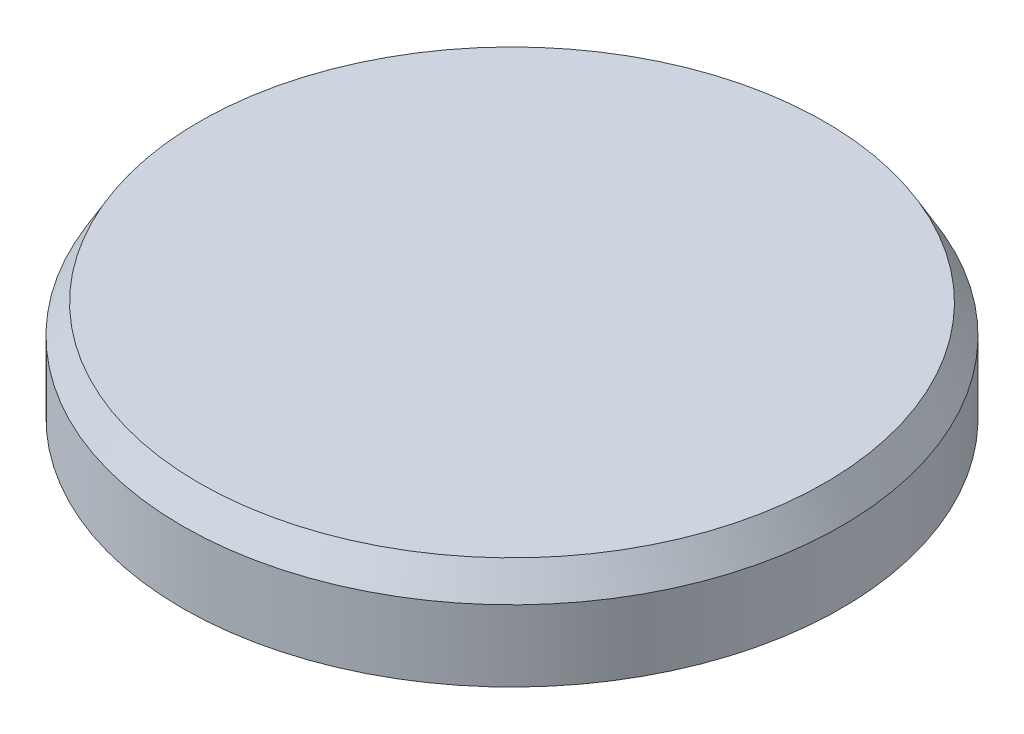
ISO-10303-21;
HEADER;
FILE_DESCRIPTION(('STEP AP214'),'2;1');
FILE_NAME('part.step','',(''),(''),'','','');
FILE_SCHEMA(('AUTOMOTIVE_DESIGN { 1 0 10303 214 1 1 1 1 }'));
ENDSEC;
DATA;
#1=APPLICATION_CONTEXT('core data for automotive mechanical design processes');
#2=APPLICATION_PROTOCOL_DEFINITION('international standard','automotive_design',2000,#1);
#3=PRODUCT_CONTEXT('',#1,'mechanical');
#4=PRODUCT('Part','Part','',(#3));
#5=PRODUCT_RELATED_PRODUCT_CATEGORY('part','',(#4));
#6=PRODUCT_DEFINITION_FORMATION('','',#4);
#7=PRODUCT_DEFINITION_CONTEXT('part definition',#1,'design');
#8=PRODUCT_DEFINITION('design','',#6,#7);
#9=PRODUCT_DEFINITION_SHAPE('','',#8);
#10=(LENGTH_UNIT() NAMED_UNIT(*) SI_UNIT(.MILLI.,.METRE.));
#11=(NAMED_UNIT(*) PLANE_ANGLE_UNIT() SI_UNIT($,.RADIAN.));
#12=(NAMED_UNIT(*) SI_UNIT($,.STERADIAN.) SOLID_ANGLE_UNIT());
#13=UNCERTAINTY_MEASURE_WITH_UNIT(LENGTH_MEASURE(1.E-05),#10,'distance_accuracy_value','');
#14=(GEOMETRIC_REPRESENTATION_CONTEXT(3) GLOBAL_UNCERTAINTY_ASSIGNED_CONTEXT((#13)) GLOBAL_UNIT_ASSIGNED_CONTEXT((#10,
#11,#12)) REPRESENTATION_CONTEXT('',''));
#15=CARTESIAN_POINT('',(0.,0.,0.));
#16=DIRECTION('',(0.,0.,1.));
#17=DIRECTION('',(1.,0.,0.));
#18=AXIS2_PLACEMENT_3D('',#15,#16,#17);
#19=CARTESIAN_POINT('',(0.,-46.6690475583121,0.));
#20=DIRECTION('',(0.,1.,0.));
#21=DIRECTION('',(0.,0.,1.));
#22=AXIS2_PLACEMENT_3D('',#19,#20,#21);
#23=CYLINDRICAL_SURFACE('',#22,16.5);
#24=CARTESIAN_POINT('',(0.,0.,0.));
#25=DIRECTION('',(0.,1.,0.));
#26=DIRECTION('',(0.,0.,1.));
#27=AXIS2_PLACEMENT_3D('',#24,#25,#26);
#28=CIRCLE('',#27,16.5);
#29=CARTESIAN_POINT('',(-12.1854020358643,0.,-11.1250158302968));
#30=VERTEX_POINT('',#29);
#31=CARTESIAN_POINT('',(-12.1854020358645,0.,11.1250158302966));
#32=VERTEX_POINT('',#31);
#33=EDGE_CURVE('E55',#30,#32,#28,.T.);
#34=ORIENTED_EDGE('',*,*,#33,.F.);
#35=DIRECTION('',(0.,1.,0.));
#36=VECTOR('',#35,1.);
#37=CARTESIAN_POINT('',(-12.1854020358644,-10.1044874653482,-11.1250158302967));
#38=LINE('',#37,#36);
#39=CARTESIAN_POINT('',(-12.1854020358643,4.,-11.1250158302968));
#40=VERTEX_POINT('',#39);
#41=EDGE_CURVE('E159',#30,#40,#38,.T.);
#42=ORIENTED_EDGE('',*,*,#41,.T.);
#43=CARTESIAN_POINT('',(0.,4.,0.));
#44=DIRECTION('',(0.,-1.,0.));
#45=DIRECTION('',(0.,0.,-1.));
#46=AXIS2_PLACEMENT_3D('',#43,#44,#45);
#47=CIRCLE('',#46,16.5);
#48=CARTESIAN_POINT('',(-12.1854020358645,4.,11.1250158302966));
#49=VERTEX_POINT('',#48);
#50=EDGE_CURVE('E226',#49,#40,#47,.T.);
#51=ORIENTED_EDGE('',*,*,#50,.F.);
#52=DIRECTION('',(0.,1.,0.));
#53=VECTOR('',#52,1.);
#54=CARTESIAN_POINT('',(-12.1854020358645,-10.1044874653482,11.1250158302966));
#55=LINE('',#54,#53);
#56=EDGE_CURVE('E182',#32,#49,#55,.T.);
#57=ORIENTED_EDGE('',*,*,#56,.F.);
#58=EDGE_LOOP('',(#34,#42,#51,#57));
#59=FACE_BOUND('',#58,.T.);
#60=ADVANCED_FACE('F39',(#59),#23,.F.);
#61=CARTESIAN_POINT('',(-3.54184530860856,4.,-16.1153756335336));
#62=VERTEX_POINT('',#61);
#63=CARTESIAN_POINT('',(15.7272473444731,4.,-4.99035980323689));
#64=VERTEX_POINT('',#63);
#65=EDGE_CURVE('E202',#62,#64,#47,.T.);
#66=ORIENTED_EDGE('',*,*,#65,.F.);
#67=DIRECTION('',(0.,1.,0.));
#68=VECTOR('',#67,1.);
#69=CARTESIAN_POINT('',(-3.54184530860857,-10.1044874653482,-16.1153756335336));
#70=LINE('',#69,#68);
#71=CARTESIAN_POINT('',(-3.54184530860856,0.,-16.1153756335336));
#72=VERTEX_POINT('',#71);
#73=EDGE_CURVE('E63',#72,#62,#70,.T.);
#74=ORIENTED_EDGE('',*,*,#73,.F.);
#75=CARTESIAN_POINT('',(15.7272473444731,0.,-4.99035980323693));
#76=VERTEX_POINT('',#75);
#77=EDGE_CURVE('E227',#76,#72,#28,.T.);
#78=ORIENTED_EDGE('',*,*,#77,.F.);
#79=DIRECTION('',(0.,1.,0.));
#80=VECTOR('',#79,1.);
#81=CARTESIAN_POINT('',(15.7272473444731,-10.0666129029657,-4.99035980323693));
#82=LINE('',#81,#80);
#83=EDGE_CURVE('E214',#76,#64,#82,.T.);
#84=ORIENTED_EDGE('',*,*,#83,.T.);
#85=EDGE_LOOP('',(#66,#74,#78,#84));
#86=FACE_BOUND('',#85,.T.);
#87=ADVANCED_FACE('F244',(#86),#23,.F.);
#88=CARTESIAN_POINT('',(-3.54184530860879,0.,16.1153756335335));
#89=VERTEX_POINT('',#88);
#90=CARTESIAN_POINT('',(15.7272473444731,0.,4.99035980323688));
#91=VERTEX_POINT('',#90);
#92=EDGE_CURVE('E225',#89,#91,#28,.T.);
#93=ORIENTED_EDGE('',*,*,#92,.F.);
#94=DIRECTION('',(0.,1.,0.));
#95=VECTOR('',#94,1.);
#96=CARTESIAN_POINT('',(-3.54184530860874,-10.1044874653482,16.1153756335335));
#97=LINE('',#96,#95);
#98=CARTESIAN_POINT('',(-3.54184530860879,4.,16.1153756335335));
#99=VERTEX_POINT('',#98);
#100=EDGE_CURVE('E185',#89,#99,#97,.T.);
#101=ORIENTED_EDGE('',*,*,#100,.T.);
#102=CARTESIAN_POINT('',(15.7272473444731,4.,4.99035980323689));
#103=VERTEX_POINT('',#102);
#104=EDGE_CURVE('E222',#103,#99,#47,.T.);
#105=ORIENTED_EDGE('',*,*,#104,.F.);
#106=DIRECTION('',(0.,1.,0.));
#107=VECTOR('',#106,1.);
#108=CARTESIAN_POINT('',(15.7272473444731,-10.0666129029657,4.99035980323688));
#109=LINE('',#108,#107);
#110=EDGE_CURVE('E211',#91,#103,#109,.T.);
#111=ORIENTED_EDGE('',*,*,#110,.F.);
#112=EDGE_LOOP('',(#93,#101,#105,#111));
#113=FACE_BOUND('',#112,.T.);
#114=ADVANCED_FACE('F246',(#113),#23,.F.);
#115=CARTESIAN_POINT('',(0.,0.,0.));
#116=DIRECTION('',(0.,1.,0.));
#117=DIRECTION('',(0.,0.,1.));
#118=AXIS2_PLACEMENT_3D('',#115,#116,#117);
#119=PLANE('',#118);
#120=ORIENTED_EDGE('',*,*,#77,.T.);
#121=CARTESIAN_POINT('',(-4.27051424419143,0.,-15.9377761337697));
#122=DIRECTION('',(0.,1.,0.));
#123=DIRECTION('',(0.,0.,1.));
#124=AXIS2_PLACEMENT_3D('',#121,#122,#123);
#125=CIRCLE('',#124,0.749999999999947);
#126=CARTESIAN_POINT('',(-4.07639996036465,0.,-15.2133317640528));
#127=VERTEX_POINT('',#126);
#128=EDGE_CURVE('E154',#127,#72,#125,.T.);
#129=ORIENTED_EDGE('',*,*,#128,.F.);
#130=CARTESIAN_POINT('',(0.,0.,0.));
#131=DIRECTION('',(0.,1.,0.));
#132=DIRECTION('',(0.,0.,1.));
#133=AXIS2_PLACEMENT_3D('',#130,#131,#132);
#134=CIRCLE('',#133,15.75);
#135=CARTESIAN_POINT('',(-11.136931803688,0.,-11.1369318036883));
#136=VERTEX_POINT('',#135);
#137=EDGE_CURVE('E145',#136,#127,#134,.F.);
#138=ORIENTED_EDGE('',*,*,#137,.F.);
#139=CARTESIAN_POINT('',(-11.6672618895779,0.,-11.6672618895781));
#140=DIRECTION('',(0.,1.,0.));
#141=DIRECTION('',(0.,0.,1.));
#142=AXIS2_PLACEMENT_3D('',#139,#140,#141);
#143=CIRCLE('',#142,0.749999999999947);
#144=EDGE_CURVE('E148',#30,#136,#143,.T.);
#145=ORIENTED_EDGE('',*,*,#144,.F.);
#146=ORIENTED_EDGE('',*,*,#33,.T.);
#147=CARTESIAN_POINT('',(-11.6672618895781,0.,11.667261889578));
#148=DIRECTION('',(0.,1.,0.));
#149=DIRECTION('',(0.,0.,1.));
#150=AXIS2_PLACEMENT_3D('',#147,#148,#149);
#151=CIRCLE('',#150,0.749999999999947);
#152=CARTESIAN_POINT('',(-11.1369318036881,0.,11.1369318036881));
#153=VERTEX_POINT('',#152);
#154=EDGE_CURVE('E169',#153,#32,#151,.T.);
#155=ORIENTED_EDGE('',*,*,#154,.F.);
#156=CARTESIAN_POINT('',(0.,0.,0.));
#157=DIRECTION('',(0.,1.,0.));
#158=DIRECTION('',(0.,0.,1.));
#159=AXIS2_PLACEMENT_3D('',#156,#157,#158);
#160=CIRCLE('',#159,15.75);
#161=CARTESIAN_POINT('',(-4.07639996036487,0.,15.2133317640528));
#162=VERTEX_POINT('',#161);
#163=EDGE_CURVE('E165',#162,#153,#160,.F.);
#164=ORIENTED_EDGE('',*,*,#163,.F.);
#165=CARTESIAN_POINT('',(-4.27051424419165,0.,15.9377761337696));
#166=DIRECTION('',(0.,1.,0.));
#167=DIRECTION('',(0.,0.,1.));
#168=AXIS2_PLACEMENT_3D('',#165,#166,#167);
#169=CIRCLE('',#168,0.749999999999947);
#170=EDGE_CURVE('E162',#89,#162,#169,.T.);
#171=ORIENTED_EDGE('',*,*,#170,.F.);
#172=ORIENTED_EDGE('',*,*,#92,.T.);
#173=CARTESIAN_POINT('',(15.9377761337696,0.,4.27051424419161));
#174=DIRECTION('',(0.,1.,0.));
#175=DIRECTION('',(0.,0.,1.));
#176=AXIS2_PLACEMENT_3D('',#173,#174,#175);
#177=CIRCLE('',#176,0.749999999999947);
#178=CARTESIAN_POINT('',(15.2133317640528,0.,4.07639996036462));
#179=VERTEX_POINT('',#178);
#180=EDGE_CURVE('E199',#179,#91,#177,.T.);
#181=ORIENTED_EDGE('',*,*,#180,.F.);
#182=CARTESIAN_POINT('',(0.,0.,0.));
#183=DIRECTION('',(0.,1.,0.));
#184=DIRECTION('',(0.,0.,1.));
#185=AXIS2_PLACEMENT_3D('',#182,#183,#184);
#186=CIRCLE('',#185,15.75);
#187=CARTESIAN_POINT('',(15.2133317640529,0.,-4.07639996036463));
#188=VERTEX_POINT('',#187);
#189=EDGE_CURVE('E195',#188,#179,#186,.F.);
#190=ORIENTED_EDGE('',*,*,#189,.F.);
#191=CARTESIAN_POINT('',(15.9377761337696,0.,-4.27051424419161));
#192=DIRECTION('',(0.,1.,0.));
#193=DIRECTION('',(0.,0.,1.));
#194=AXIS2_PLACEMENT_3D('',#191,#192,#193);
#195=CIRCLE('',#194,0.749999999999947);
#196=EDGE_CURVE('E192',#76,#188,#195,.T.);
#197=ORIENTED_EDGE('',*,*,#196,.F.);
#198=EDGE_LOOP('',(#120,#129,#138,#145,#146,#155,#164,#171,#172,#181,#190,#197));
#199=FACE_BOUND('',#198,.T.);
#200=CARTESIAN_POINT('',(0.,0.,0.));
#201=DIRECTION('',(0.,1.,0.));
#202=DIRECTION('',(0.,0.,1.));
#203=AXIS2_PLACEMENT_3D('',#200,#201,#202);
#204=CIRCLE('',#203,19.75);
#205=CARTESIAN_POINT('',(0.,0.,19.75));
#206=VERTEX_POINT('',#205);
#207=EDGE_CURVE('E229',#206,#206,#204,.T.);
#208=ORIENTED_EDGE('',*,*,#207,.F.);
#209=EDGE_LOOP('',(#208));
#210=FACE_BOUND('',#209,.T.);
#211=ADVANCED_FACE('F253',(#199,#210),#119,.F.);
#212=CARTESIAN_POINT('',(0.,4.,0.));
#213=DIRECTION('',(0.,-1.,0.));
#214=DIRECTION('',(0.,0.,-1.));
#215=AXIS2_PLACEMENT_3D('',#212,#213,#214);
#216=CYLINDRICAL_SURFACE('',#215,19.75);
#217=CARTESIAN_POINT('',(0.,4.26794919243114,0.));
#218=DIRECTION('',(0.,1.,0.));
#219=DIRECTION('',(0.,0.,1.));
#220=AXIS2_PLACEMENT_3D('',#217,#218,#219);
#221=CIRCLE('',#220,19.75);
#222=CARTESIAN_POINT('',(0.,4.26794919243114,19.75));
#223=VERTEX_POINT('',#222);
#224=EDGE_CURVE('E11',#223,#223,#221,.F.);
#225=ORIENTED_EDGE('',*,*,#224,.T.);
#226=EDGE_LOOP('',(#225));
#227=FACE_BOUND('',#226,.T.);
#228=ORIENTED_EDGE('',*,*,#207,.T.);
#229=EDGE_LOOP('',(#228));
#230=FACE_BOUND('',#229,.T.);
#231=ADVANCED_FACE('F258',(#227,#230),#216,.T.);
#232=CARTESIAN_POINT('',(0.,6.,0.));
#233=DIRECTION('',(0.,1.,0.));
#234=DIRECTION('',(0.,0.,1.));
#235=AXIS2_PLACEMENT_3D('',#232,#233,#234);
#236=PLANE('',#235);
#237=CARTESIAN_POINT('',(0.,6.,0.));
#238=DIRECTION('',(0.,1.,0.));
#239=DIRECTION('',(0.,0.,1.));
#240=AXIS2_PLACEMENT_3D('',#237,#238,#239);
#241=CIRCLE('',#240,18.75);
#242=CARTESIAN_POINT('',(0.,6.,18.75));
#243=VERTEX_POINT('',#242);
#244=EDGE_CURVE('E48',#243,#243,#241,.T.);
#245=ORIENTED_EDGE('',*,*,#244,.T.);
#246=EDGE_LOOP('',(#245));
#247=FACE_BOUND('',#246,.T.);
#248=ADVANCED_FACE('F234',(#247),#236,.T.);
#249=CARTESIAN_POINT('',(0.,4.,0.));
#250=DIRECTION('',(0.,1.,0.));
#251=DIRECTION('',(0.,0.,1.));
#252=AXIS2_PLACEMENT_3D('',#249,#250,#251);
#253=PLANE('',#252);
#254=CARTESIAN_POINT('',(-11.6672618895779,4.,-11.6672618895781));
#255=DIRECTION('',(0.,-1.,0.));
#256=DIRECTION('',(0.866025403784443,0.,-0.499999999999992));
#257=AXIS2_PLACEMENT_3D('',#254,#255,#256);
#258=CIRCLE('',#257,0.749999999999947);
#259=CARTESIAN_POINT('',(-11.136931803688,4.,-11.1369318036883));
#260=VERTEX_POINT('',#259);
#261=EDGE_CURVE('E136',#260,#40,#258,.T.);
#262=ORIENTED_EDGE('',*,*,#261,.F.);
#263=CARTESIAN_POINT('',(0.,4.,0.));
#264=DIRECTION('',(0.,1.,0.));
#265=DIRECTION('',(0.866025403784443,0.,-0.499999999999992));
#266=AXIS2_PLACEMENT_3D('',#263,#264,#265);
#267=CIRCLE('',#266,15.75);
#268=CARTESIAN_POINT('',(-4.07639996036465,4.,-15.2133317640528));
#269=VERTEX_POINT('',#268);
#270=EDGE_CURVE('E129',#269,#260,#267,.T.);
#271=ORIENTED_EDGE('',*,*,#270,.F.);
#272=CARTESIAN_POINT('',(-4.27051424419143,4.,-15.9377761337697));
#273=DIRECTION('',(0.,-1.,0.));
#274=DIRECTION('',(-0.866025403784443,0.,0.499999999999992));
#275=AXIS2_PLACEMENT_3D('',#272,#273,#274);
#276=CIRCLE('',#275,0.749999999999947);
#277=EDGE_CURVE('E133',#62,#269,#276,.T.);
#278=ORIENTED_EDGE('',*,*,#277,.F.);
#279=ORIENTED_EDGE('',*,*,#65,.T.);
#280=CARTESIAN_POINT('',(15.9377761337696,4.,-4.27051424419161));
#281=DIRECTION('',(0.,-1.,0.));
#282=DIRECTION('',(0.,0.,1.));
#283=AXIS2_PLACEMENT_3D('',#280,#281,#282);
#284=CIRCLE('',#283,0.749999999999947);
#285=CARTESIAN_POINT('',(15.2133317640528,4.,-4.07639996036462));
#286=VERTEX_POINT('',#285);
#287=EDGE_CURVE('E208',#286,#64,#284,.T.);
#288=ORIENTED_EDGE('',*,*,#287,.F.);
#289=CARTESIAN_POINT('',(0.,4.,0.));
#290=DIRECTION('',(0.,1.,0.));
#291=DIRECTION('',(0.,0.,1.));
#292=AXIS2_PLACEMENT_3D('',#289,#290,#291);
#293=CIRCLE('',#292,15.75);
#294=CARTESIAN_POINT('',(15.2133317640528,4.,4.07639996036462));
#295=VERTEX_POINT('',#294);
#296=EDGE_CURVE('E205',#295,#286,#293,.T.);
#297=ORIENTED_EDGE('',*,*,#296,.F.);
#298=CARTESIAN_POINT('',(15.9377761337696,4.,4.27051424419161));
#299=DIRECTION('',(0.,-1.,0.));
#300=DIRECTION('',(0.,0.,-1.));
#301=AXIS2_PLACEMENT_3D('',#298,#299,#300);
#302=CIRCLE('',#301,0.749999999999947);
#303=EDGE_CURVE('E172',#103,#295,#302,.T.);
#304=ORIENTED_EDGE('',*,*,#303,.F.);
#305=ORIENTED_EDGE('',*,*,#104,.T.);
#306=CARTESIAN_POINT('',(-4.27051424419165,4.,15.9377761337696));
#307=DIRECTION('',(0.,-1.,0.));
#308=DIRECTION('',(-0.866025403784436,0.,-0.500000000000004));
#309=AXIS2_PLACEMENT_3D('',#306,#307,#308);
#310=CIRCLE('',#309,0.749999999999947);
#311=CARTESIAN_POINT('',(-4.07639996036486,4.,15.2133317640528));
#312=VERTEX_POINT('',#311);
#313=EDGE_CURVE('E179',#312,#99,#310,.T.);
#314=ORIENTED_EDGE('',*,*,#313,.F.);
#315=CARTESIAN_POINT('',(0.,4.,0.));
#316=DIRECTION('',(0.,1.,0.));
#317=DIRECTION('',(-0.866025403784436,0.,-0.500000000000004));
#318=AXIS2_PLACEMENT_3D('',#315,#316,#317);
#319=CIRCLE('',#318,15.75);
#320=CARTESIAN_POINT('',(-11.1369318036881,4.,11.1369318036881));
#321=VERTEX_POINT('',#320);
#322=EDGE_CURVE('E176',#321,#312,#319,.T.);
#323=ORIENTED_EDGE('',*,*,#322,.F.);
#324=CARTESIAN_POINT('',(-11.6672618895781,4.,11.667261889578));
#325=DIRECTION('',(0.,-1.,0.));
#326=DIRECTION('',(0.866025403784436,0.,0.500000000000004));
#327=AXIS2_PLACEMENT_3D('',#324,#325,#326);
#328=CIRCLE('',#327,0.749999999999947);
#329=EDGE_CURVE('E173',#49,#321,#328,.T.);
#330=ORIENTED_EDGE('',*,*,#329,.F.);
#331=ORIENTED_EDGE('',*,*,#50,.T.);
#332=EDGE_LOOP('',(#262,#271,#278,#279,#288,#297,#304,#305,#314,#323,#330,#331));
#333=FACE_BOUND('',#332,.T.);
#334=ADVANCED_FACE('F131',(#333),#253,.F.);
#335=CARTESIAN_POINT('',(15.9377761337696,-10.0666129029657,-4.27051424419161));
#336=DIRECTION('',(0.,1.,0.));
#337=DIRECTION('',(0.,0.,1.));
#338=AXIS2_PLACEMENT_3D('',#335,#336,#337);
#339=CYLINDRICAL_SURFACE('',#338,0.749999999999947);
#340=ORIENTED_EDGE('',*,*,#83,.F.);
#341=ORIENTED_EDGE('',*,*,#196,.T.);
#342=DIRECTION('',(0.,1.,0.));
#343=VECTOR('',#342,1.);
#344=CARTESIAN_POINT('',(15.2133317640528,-10.0666129029657,-4.07639996036462));
#345=LINE('',#344,#343);
#346=EDGE_CURVE('E217',#188,#286,#345,.T.);
#347=ORIENTED_EDGE('',*,*,#346,.T.);
#348=ORIENTED_EDGE('',*,*,#287,.T.);
#349=EDGE_LOOP('',(#340,#341,#347,#348));
#350=FACE_BOUND('',#349,.T.);
#351=ADVANCED_FACE('F278',(#350),#339,.T.);
#352=CARTESIAN_POINT('',(0.,-10.0666129029657,0.));
#353=DIRECTION('',(0.,1.,0.));
#354=DIRECTION('',(0.,0.,1.));
#355=AXIS2_PLACEMENT_3D('',#352,#353,#354);
#356=CYLINDRICAL_SURFACE('',#355,15.75);
#357=ORIENTED_EDGE('',*,*,#346,.F.);
#358=ORIENTED_EDGE('',*,*,#189,.T.);
#359=DIRECTION('',(0.,1.,0.));
#360=VECTOR('',#359,1.);
#361=CARTESIAN_POINT('',(15.2133317640528,-10.0666129029657,4.07639996036462));
#362=LINE('',#361,#360);
#363=EDGE_CURVE('E196',#179,#295,#362,.T.);
#364=ORIENTED_EDGE('',*,*,#363,.T.);
#365=ORIENTED_EDGE('',*,*,#296,.T.);
#366=EDGE_LOOP('',(#357,#358,#364,#365));
#367=FACE_BOUND('',#366,.T.);
#368=ADVANCED_FACE('F276',(#367),#356,.F.);
#369=CARTESIAN_POINT('',(15.9377761337696,-10.0666129029657,4.27051424419161));
#370=DIRECTION('',(0.,1.,0.));
#371=DIRECTION('',(0.,0.,1.));
#372=AXIS2_PLACEMENT_3D('',#369,#370,#371);
#373=CYLINDRICAL_SURFACE('',#372,0.749999999999947);
#374=ORIENTED_EDGE('',*,*,#363,.F.);
#375=ORIENTED_EDGE('',*,*,#180,.T.);
#376=ORIENTED_EDGE('',*,*,#110,.T.);
#377=ORIENTED_EDGE('',*,*,#303,.T.);
#378=EDGE_LOOP('',(#374,#375,#376,#377));
#379=FACE_BOUND('',#378,.T.);
#380=ADVANCED_FACE('F271',(#379),#373,.T.);
#381=CARTESIAN_POINT('',(-4.27051424419165,-10.1044874653482,15.9377761337696));
#382=DIRECTION('',(0.,1.,0.));
#383=DIRECTION('',(0.,0.,1.));
#384=AXIS2_PLACEMENT_3D('',#381,#382,#383);
#385=CYLINDRICAL_SURFACE('',#384,0.749999999999947);
#386=ORIENTED_EDGE('',*,*,#100,.F.);
#387=ORIENTED_EDGE('',*,*,#170,.T.);
#388=DIRECTION('',(0.,1.,0.));
#389=VECTOR('',#388,1.);
#390=CARTESIAN_POINT('',(-4.07639996036486,-10.1044874653482,15.2133317640528));
#391=LINE('',#390,#389);
#392=EDGE_CURVE('E187',#162,#312,#391,.T.);
#393=ORIENTED_EDGE('',*,*,#392,.T.);
#394=ORIENTED_EDGE('',*,*,#313,.T.);
#395=EDGE_LOOP('',(#386,#387,#393,#394));
#396=FACE_BOUND('',#395,.T.);
#397=ADVANCED_FACE('F268',(#396),#385,.T.);
#398=CARTESIAN_POINT('',(0.,-10.1044874653482,0.));
#399=DIRECTION('',(0.,1.,0.));
#400=DIRECTION('',(0.,0.,1.));
#401=AXIS2_PLACEMENT_3D('',#398,#399,#400);
#402=CYLINDRICAL_SURFACE('',#401,15.75);
#403=ORIENTED_EDGE('',*,*,#392,.F.);
#404=ORIENTED_EDGE('',*,*,#163,.T.);
#405=DIRECTION('',(0.,1.,0.));
#406=VECTOR('',#405,1.);
#407=CARTESIAN_POINT('',(-11.1369318036881,-10.1044874653482,11.1369318036881));
#408=LINE('',#407,#406);
#409=EDGE_CURVE('E166',#153,#321,#408,.T.);
#410=ORIENTED_EDGE('',*,*,#409,.T.);
#411=ORIENTED_EDGE('',*,*,#322,.T.);
#412=EDGE_LOOP('',(#403,#404,#410,#411));
#413=FACE_BOUND('',#412,.T.);
#414=ADVANCED_FACE('F289',(#413),#402,.F.);
#415=CARTESIAN_POINT('',(-11.6672618895781,-10.1044874653482,11.667261889578));
#416=DIRECTION('',(0.,1.,0.));
#417=DIRECTION('',(0.,0.,1.));
#418=AXIS2_PLACEMENT_3D('',#415,#416,#417);
#419=CYLINDRICAL_SURFACE('',#418,0.749999999999947);
#420=ORIENTED_EDGE('',*,*,#409,.F.);
#421=ORIENTED_EDGE('',*,*,#154,.T.);
#422=ORIENTED_EDGE('',*,*,#56,.T.);
#423=ORIENTED_EDGE('',*,*,#329,.T.);
#424=EDGE_LOOP('',(#420,#421,#422,#423));
#425=FACE_BOUND('',#424,.T.);
#426=ADVANCED_FACE('F287',(#425),#419,.T.);
#427=CARTESIAN_POINT('',(-11.6672618895779,-10.1044874653482,-11.6672618895781));
#428=DIRECTION('',(0.,1.,0.));
#429=DIRECTION('',(0.,0.,1.));
#430=AXIS2_PLACEMENT_3D('',#427,#428,#429);
#431=CYLINDRICAL_SURFACE('',#430,0.749999999999947);
#432=ORIENTED_EDGE('',*,*,#41,.F.);
#433=ORIENTED_EDGE('',*,*,#144,.T.);
#434=DIRECTION('',(0.,1.,0.));
#435=VECTOR('',#434,1.);
#436=CARTESIAN_POINT('',(-11.136931803688,-10.1044874653482,-11.1369318036883));
#437=LINE('',#436,#435);
#438=EDGE_CURVE('E149',#136,#260,#437,.T.);
#439=ORIENTED_EDGE('',*,*,#438,.T.);
#440=ORIENTED_EDGE('',*,*,#261,.T.);
#441=EDGE_LOOP('',(#432,#433,#439,#440));
#442=FACE_BOUND('',#441,.T.);
#443=ADVANCED_FACE('F283',(#442),#431,.T.);
#444=CARTESIAN_POINT('',(0.,-10.1044874653482,0.));
#445=DIRECTION('',(0.,1.,0.));
#446=DIRECTION('',(0.,0.,1.));
#447=AXIS2_PLACEMENT_3D('',#444,#445,#446);
#448=CYLINDRICAL_SURFACE('',#447,15.75);
#449=ORIENTED_EDGE('',*,*,#438,.F.);
#450=ORIENTED_EDGE('',*,*,#137,.T.);
#451=DIRECTION('',(0.,1.,0.));
#452=VECTOR('',#451,1.);
#453=CARTESIAN_POINT('',(-4.07639996036465,-10.1044874653482,-15.2133317640528));
#454=LINE('',#453,#452);
#455=EDGE_CURVE('E143',#127,#269,#454,.T.);
#456=ORIENTED_EDGE('',*,*,#455,.T.);
#457=ORIENTED_EDGE('',*,*,#270,.T.);
#458=EDGE_LOOP('',(#449,#450,#456,#457));
#459=FACE_BOUND('',#458,.T.);
#460=ADVANCED_FACE('F144',(#459),#448,.F.);
#461=CARTESIAN_POINT('',(-4.27051424419143,-10.1044874653482,-15.9377761337697));
#462=DIRECTION('',(0.,1.,0.));
#463=DIRECTION('',(0.,0.,1.));
#464=AXIS2_PLACEMENT_3D('',#461,#462,#463);
#465=CYLINDRICAL_SURFACE('',#464,0.749999999999947);
#466=ORIENTED_EDGE('',*,*,#455,.F.);
#467=ORIENTED_EDGE('',*,*,#128,.T.);
#468=ORIENTED_EDGE('',*,*,#73,.T.);
#469=ORIENTED_EDGE('',*,*,#277,.T.);
#470=EDGE_LOOP('',(#466,#467,#468,#469));
#471=FACE_BOUND('',#470,.T.);
#472=ADVANCED_FACE('F151',(#471),#465,.T.);
#473=CARTESIAN_POINT('',(0.,6.,0.));
#474=DIRECTION('',(0.,-1.,0.));
#475=DIRECTION('',(0.,0.,-1.));
#476=AXIS2_PLACEMENT_3D('',#473,#474,#475);
#477=CONICAL_SURFACE('',#476,18.75,0.523598775598301);
#478=ORIENTED_EDGE('',*,*,#224,.F.);
#479=EDGE_LOOP('',(#478));
#480=FACE_BOUND('',#479,.T.);
#481=ORIENTED_EDGE('',*,*,#244,.F.);
#482=EDGE_LOOP('',(#481));
#483=FACE_BOUND('',#482,.T.);
#484=ADVANCED_FACE('F42',(#480,#483),#477,.T.);
#485=CLOSED_SHELL('',(#60,#87,#114,#211,#231,#248,#334,#351,#368,#380,#397,#414,#426,#443,#460,
#472,#484));
#486=MANIFOLD_SOLID_BREP('B2',#485);
#487=ADVANCED_BREP_SHAPE_REPRESENTATION('',(#18,#486),#14);
#488=SHAPE_DEFINITION_REPRESENTATION(#9,#487);
ENDSEC;
END-ISO-10303-21;
